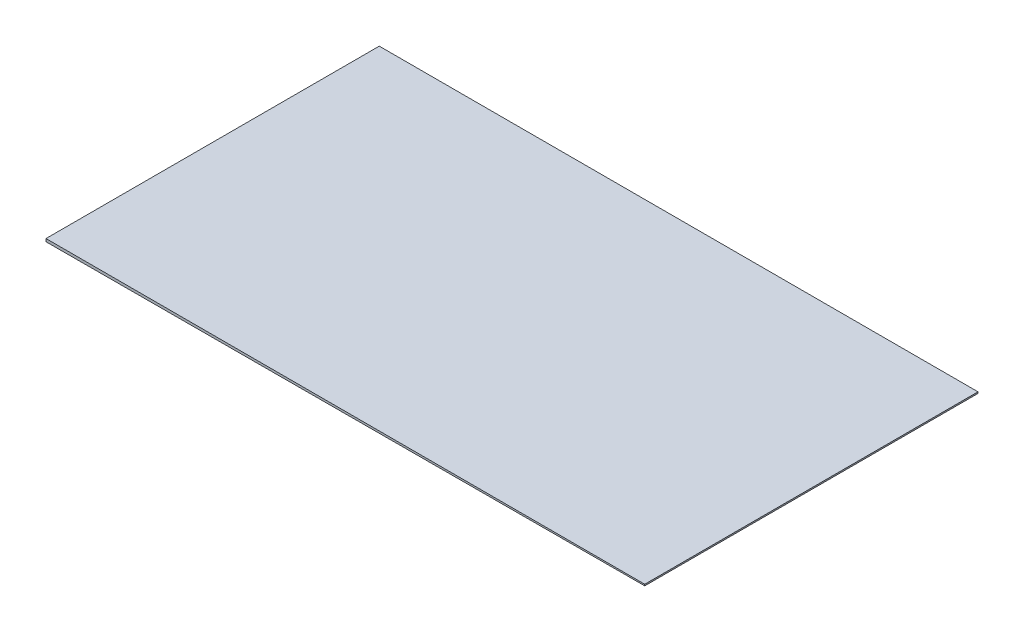
ISO-10303-21;
HEADER;
FILE_DESCRIPTION(('STEP AP214'),'2;1');
FILE_NAME('part.step','',(''),(''),'','','');
FILE_SCHEMA(('AUTOMOTIVE_DESIGN { 1 0 10303 214 1 1 1 1 }'));
ENDSEC;
DATA;
#1=APPLICATION_CONTEXT('core data for automotive mechanical design processes');
#2=APPLICATION_PROTOCOL_DEFINITION('international standard','automotive_design',2000,#1);
#3=PRODUCT_CONTEXT('',#1,'mechanical');
#4=PRODUCT('Part','Part','',(#3));
#5=PRODUCT_RELATED_PRODUCT_CATEGORY('part','',(#4));
#6=PRODUCT_DEFINITION_FORMATION('','',#4);
#7=PRODUCT_DEFINITION_CONTEXT('part definition',#1,'design');
#8=PRODUCT_DEFINITION('design','',#6,#7);
#9=PRODUCT_DEFINITION_SHAPE('','',#8);
#10=(LENGTH_UNIT() NAMED_UNIT(*) SI_UNIT(.MILLI.,.METRE.));
#11=(NAMED_UNIT(*) PLANE_ANGLE_UNIT() SI_UNIT($,.RADIAN.));
#12=(NAMED_UNIT(*) SI_UNIT($,.STERADIAN.) SOLID_ANGLE_UNIT());
#13=UNCERTAINTY_MEASURE_WITH_UNIT(LENGTH_MEASURE(1.E-05),#10,'distance_accuracy_value','');
#14=(GEOMETRIC_REPRESENTATION_CONTEXT(3) GLOBAL_UNCERTAINTY_ASSIGNED_CONTEXT((#13)) GLOBAL_UNIT_ASSIGNED_CONTEXT((#10,
#11,#12)) REPRESENTATION_CONTEXT('',''));
#15=CARTESIAN_POINT('',(0.,0.,0.));
#16=DIRECTION('',(0.,0.,1.));
#17=DIRECTION('',(1.,0.,0.));
#18=AXIS2_PLACEMENT_3D('',#15,#16,#17);
#19=CARTESIAN_POINT('',(530.,5.,-295.));
#20=DIRECTION('',(-1.,0.,0.));
#21=DIRECTION('',(0.,0.,1.));
#22=AXIS2_PLACEMENT_3D('',#19,#20,#21);
#23=PLANE('',#22);
#24=DIRECTION('',(0.,-1.,0.));
#25=VECTOR('',#24,1.);
#26=CARTESIAN_POINT('',(530.,5.,295.));
#27=LINE('',#26,#25);
#28=CARTESIAN_POINT('',(530.,5.,295.));
#29=VERTEX_POINT('',#28);
#30=CARTESIAN_POINT('',(530.,2.45559845559846,295.));
#31=VERTEX_POINT('',#30);
#32=EDGE_CURVE('E165',#29,#31,#27,.T.);
#33=ORIENTED_EDGE('',*,*,#32,.T.);
#34=DIRECTION('',(0.,0.,-1.));
#35=VECTOR('',#34,1.);
#36=CARTESIAN_POINT('',(530.,2.45559845559846,-295.));
#37=LINE('',#36,#35);
#38=CARTESIAN_POINT('',(530.,2.45559845559846,-295.));
#39=VERTEX_POINT('',#38);
#40=EDGE_CURVE('E160',#31,#39,#37,.T.);
#41=ORIENTED_EDGE('',*,*,#40,.T.);
#42=DIRECTION('',(0.,-1.,0.));
#43=VECTOR('',#42,1.);
#44=CARTESIAN_POINT('',(530.,5.,-295.));
#45=LINE('',#44,#43);
#46=CARTESIAN_POINT('',(530.,5.,-295.));
#47=VERTEX_POINT('',#46);
#48=EDGE_CURVE('E13',#47,#39,#45,.T.);
#49=ORIENTED_EDGE('',*,*,#48,.F.);
#50=DIRECTION('',(0.,0.,-1.));
#51=VECTOR('',#50,1.);
#52=CARTESIAN_POINT('',(530.,5.,-295.));
#53=LINE('',#52,#51);
#54=EDGE_CURVE('E153',#29,#47,#53,.T.);
#55=ORIENTED_EDGE('',*,*,#54,.F.);
#56=EDGE_LOOP('',(#33,#41,#49,#55));
#57=FACE_BOUND('',#56,.T.);
#58=ADVANCED_FACE('F106',(#57),#23,.F.);
#59=CARTESIAN_POINT('',(-530.,5.,-295.));
#60=DIRECTION('',(0.,0.,1.));
#61=DIRECTION('',(1.,0.,0.));
#62=AXIS2_PLACEMENT_3D('',#59,#60,#61);
#63=PLANE('',#62);
#64=ORIENTED_EDGE('',*,*,#48,.T.);
#65=DIRECTION('',(-0.999997316687654,-0.00231659610043472,0.));
#66=VECTOR('',#65,1.);
#67=CARTESIAN_POINT('',(-529.988417050579,2.68330874620554E-05,-295.));
#68=LINE('',#67,#66);
#69=CARTESIAN_POINT('',(-530.,0.,-295.));
#70=VERTEX_POINT('',#69);
#71=EDGE_CURVE('E145',#39,#70,#68,.T.);
#72=ORIENTED_EDGE('',*,*,#71,.T.);
#73=DIRECTION('',(0.,-1.,0.));
#74=VECTOR('',#73,1.);
#75=CARTESIAN_POINT('',(-530.,5.,-295.));
#76=LINE('',#75,#74);
#77=CARTESIAN_POINT('',(-530.,5.,-295.));
#78=VERTEX_POINT('',#77);
#79=EDGE_CURVE('E114',#78,#70,#76,.T.);
#80=ORIENTED_EDGE('',*,*,#79,.F.);
#81=DIRECTION('',(-1.,0.,0.));
#82=VECTOR('',#81,1.);
#83=CARTESIAN_POINT('',(-530.,5.,-295.));
#84=LINE('',#83,#82);
#85=EDGE_CURVE('E172',#47,#78,#84,.T.);
#86=ORIENTED_EDGE('',*,*,#85,.F.);
#87=EDGE_LOOP('',(#64,#72,#80,#86));
#88=FACE_BOUND('',#87,.T.);
#89=ADVANCED_FACE('F157',(#88),#63,.F.);
#90=CARTESIAN_POINT('',(-530.,5.,-295.));
#91=DIRECTION('',(1.,0.,0.));
#92=DIRECTION('',(0.,0.,-1.));
#93=AXIS2_PLACEMENT_3D('',#90,#91,#92);
#94=PLANE('',#93);
#95=DIRECTION('',(0.,0.,1.));
#96=VECTOR('',#95,1.);
#97=CARTESIAN_POINT('',(-530.,0.,-295.));
#98=LINE('',#97,#96);
#99=CARTESIAN_POINT('',(-530.,0.,295.));
#100=VERTEX_POINT('',#99);
#101=EDGE_CURVE('E142',#70,#100,#98,.T.);
#102=ORIENTED_EDGE('',*,*,#101,.T.);
#103=DIRECTION('',(0.,-1.,0.));
#104=VECTOR('',#103,1.);
#105=CARTESIAN_POINT('',(-530.,5.,295.));
#106=LINE('',#105,#104);
#107=CARTESIAN_POINT('',(-530.,5.,295.));
#108=VERTEX_POINT('',#107);
#109=EDGE_CURVE('E164',#108,#100,#106,.T.);
#110=ORIENTED_EDGE('',*,*,#109,.F.);
#111=DIRECTION('',(0.,0.,1.));
#112=VECTOR('',#111,1.);
#113=CARTESIAN_POINT('',(-530.,5.,-295.));
#114=LINE('',#113,#112);
#115=EDGE_CURVE('E163',#78,#108,#114,.T.);
#116=ORIENTED_EDGE('',*,*,#115,.F.);
#117=ORIENTED_EDGE('',*,*,#79,.T.);
#118=EDGE_LOOP('',(#102,#110,#116,#117));
#119=FACE_BOUND('',#118,.T.);
#120=ADVANCED_FACE('F162',(#119),#94,.F.);
#121=CARTESIAN_POINT('',(-530.,5.,295.));
#122=DIRECTION('',(0.,0.,-1.));
#123=DIRECTION('',(-1.,0.,0.));
#124=AXIS2_PLACEMENT_3D('',#121,#122,#123);
#125=PLANE('',#124);
#126=ORIENTED_EDGE('',*,*,#109,.T.);
#127=DIRECTION('',(0.999997316687654,0.00231659610043472,0.));
#128=VECTOR('',#127,1.);
#129=CARTESIAN_POINT('',(-529.988417050579,2.68330874620554E-05,295.));
#130=LINE('',#129,#128);
#131=EDGE_CURVE('E148',#100,#31,#130,.T.);
#132=ORIENTED_EDGE('',*,*,#131,.T.);
#133=ORIENTED_EDGE('',*,*,#32,.F.);
#134=DIRECTION('',(1.,0.,0.));
#135=VECTOR('',#134,1.);
#136=CARTESIAN_POINT('',(-530.,5.,295.));
#137=LINE('',#136,#135);
#138=EDGE_CURVE('E121',#108,#29,#137,.T.);
#139=ORIENTED_EDGE('',*,*,#138,.F.);
#140=EDGE_LOOP('',(#126,#132,#133,#139));
#141=FACE_BOUND('',#140,.T.);
#142=ADVANCED_FACE('F177',(#141),#125,.F.);
#143=CARTESIAN_POINT('',(0.,5.,0.));
#144=DIRECTION('',(0.,1.,0.));
#145=DIRECTION('',(0.,0.,1.));
#146=AXIS2_PLACEMENT_3D('',#143,#144,#145);
#147=PLANE('',#146);
#148=ORIENTED_EDGE('',*,*,#54,.T.);
#149=ORIENTED_EDGE('',*,*,#85,.T.);
#150=ORIENTED_EDGE('',*,*,#115,.T.);
#151=ORIENTED_EDGE('',*,*,#138,.T.);
#152=EDGE_LOOP('',(#148,#149,#150,#151));
#153=FACE_BOUND('',#152,.T.);
#154=ADVANCED_FACE('F180',(#153),#147,.T.);
#155=CARTESIAN_POINT('',(-530.,0.,-819.500000000001));
#156=DIRECTION('',(-0.00231659610043472,0.999997316687654,0.));
#157=DIRECTION('',(-0.999997316687654,-0.00231659610043472,0.));
#158=AXIS2_PLACEMENT_3D('',#155,#156,#157);
#159=PLANE('',#158);
#160=ORIENTED_EDGE('',*,*,#40,.F.);
#161=ORIENTED_EDGE('',*,*,#131,.F.);
#162=ORIENTED_EDGE('',*,*,#101,.F.);
#163=ORIENTED_EDGE('',*,*,#71,.F.);
#164=EDGE_LOOP('',(#160,#161,#162,#163));
#165=FACE_BOUND('',#164,.T.);
#166=ADVANCED_FACE('F144',(#165),#159,.F.);
#167=CLOSED_SHELL('',(#58,#89,#120,#142,#154,#166));
#168=MANIFOLD_SOLID_BREP('B2',#167);
#169=ADVANCED_BREP_SHAPE_REPRESENTATION('',(#18,#168),#14);
#170=SHAPE_DEFINITION_REPRESENTATION(#9,#169);
ENDSEC;
END-ISO-10303-21;
